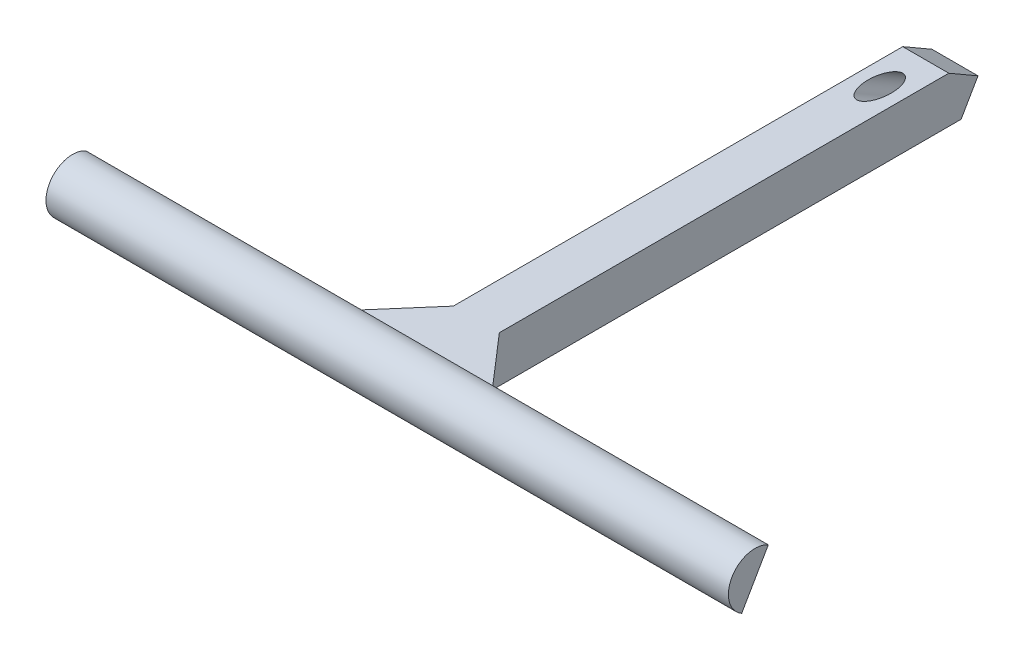
ISO-10303-21;
HEADER;
FILE_DESCRIPTION(('STEP AP214'),'2;1');
FILE_NAME('part.step','',(''),(''),'','','');
FILE_SCHEMA(('AUTOMOTIVE_DESIGN { 1 0 10303 214 1 1 1 1 }'));
ENDSEC;
DATA;
#1=APPLICATION_CONTEXT('core data for automotive mechanical design processes');
#2=APPLICATION_PROTOCOL_DEFINITION('international standard','automotive_design',2000,#1);
#3=PRODUCT_CONTEXT('',#1,'mechanical');
#4=PRODUCT('Part','Part','',(#3));
#5=PRODUCT_RELATED_PRODUCT_CATEGORY('part','',(#4));
#6=PRODUCT_DEFINITION_FORMATION('','',#4);
#7=PRODUCT_DEFINITION_CONTEXT('part definition',#1,'design');
#8=PRODUCT_DEFINITION('design','',#6,#7);
#9=PRODUCT_DEFINITION_SHAPE('','',#8);
#10=(LENGTH_UNIT() NAMED_UNIT(*) SI_UNIT(.MILLI.,.METRE.));
#11=(NAMED_UNIT(*) PLANE_ANGLE_UNIT() SI_UNIT($,.RADIAN.));
#12=(NAMED_UNIT(*) SI_UNIT($,.STERADIAN.) SOLID_ANGLE_UNIT());
#13=UNCERTAINTY_MEASURE_WITH_UNIT(LENGTH_MEASURE(1.E-05),#10,'distance_accuracy_value','');
#14=(GEOMETRIC_REPRESENTATION_CONTEXT(3) GLOBAL_UNCERTAINTY_ASSIGNED_CONTEXT((#13)) GLOBAL_UNIT_ASSIGNED_CONTEXT((#10,
#11,#12)) REPRESENTATION_CONTEXT('',''));
#15=CARTESIAN_POINT('',(0.,0.,0.));
#16=DIRECTION('',(0.,0.,1.));
#17=DIRECTION('',(1.,0.,0.));
#18=AXIS2_PLACEMENT_3D('',#15,#16,#17);
#19=CARTESIAN_POINT('',(0.,2.7,0.));
#20=DIRECTION('',(0.,1.,0.));
#21=DIRECTION('',(0.,0.,1.));
#22=AXIS2_PLACEMENT_3D('',#19,#20,#21);
#23=PLANE('',#22);
#24=CARTESIAN_POINT('',(0.,2.7,-23.6765371804359));
#25=DIRECTION('',(0.,1.,0.));
#26=DIRECTION('',(0.,0.,-1.));
#27=AXIS2_PLACEMENT_3D('',#24,#25,#26);
#28=ELLIPSE('',#27,2.70000000000004,1.35);
#29=CARTESIAN_POINT('',(0.,2.7,-26.3765371804359));
#30=VERTEX_POINT('',#29);
#31=EDGE_CURVE('E161',#30,#30,#28,.T.);
#32=ORIENTED_EDGE('',*,*,#31,.F.);
#33=EDGE_LOOP('',(#32));
#34=FACE_BOUND('',#33,.T.);
#35=DIRECTION('',(0.,0.,-1.));
#36=VECTOR('',#35,1.);
#37=CARTESIAN_POINT('',(-2.7,2.7,0.));
#38=LINE('',#37,#36);
#39=CARTESIAN_POINT('',(-2.7,2.7,23.6088058544797));
#40=VERTEX_POINT('',#39);
#41=CARTESIAN_POINT('',(-2.7,2.7,-29.076537180436));
#42=VERTEX_POINT('',#41);
#43=EDGE_CURVE('E184',#40,#42,#38,.T.);
#44=ORIENTED_EDGE('',*,*,#43,.F.);
#45=DIRECTION('',(-0.654653670707974,0.,0.755928946018457));
#46=VECTOR('',#45,1.);
#47=CARTESIAN_POINT('',(0.220832231856313,2.7,20.2361193038398));
#48=LINE('',#47,#46);
#49=CARTESIAN_POINT('',(-7.69999999999999,2.7,29.382308546376));
#50=VERTEX_POINT('',#49);
#51=EDGE_CURVE('E203',#40,#50,#48,.T.);
#52=ORIENTED_EDGE('',*,*,#51,.T.);
#53=DIRECTION('',(-1.,0.,0.));
#54=VECTOR('',#53,1.);
#55=CARTESIAN_POINT('',(40.,2.7,29.382308546376));
#56=LINE('',#55,#54);
#57=CARTESIAN_POINT('',(7.70000000000005,2.7,29.382308546376));
#58=VERTEX_POINT('',#57);
#59=EDGE_CURVE('E224',#58,#50,#56,.T.);
#60=ORIENTED_EDGE('',*,*,#59,.F.);
#61=DIRECTION('',(0.654653670707981,0.,0.755928946018451));
#62=VECTOR('',#61,1.);
#63=CARTESIAN_POINT('',(4.64345348242944,2.7,25.852912636956));
#64=LINE('',#63,#62);
#65=CARTESIAN_POINT('',(2.7,2.7,23.6088058544798));
#66=VERTEX_POINT('',#65);
#67=EDGE_CURVE('E208',#58,#66,#64,.F.);
#68=ORIENTED_EDGE('',*,*,#67,.T.);
#69=DIRECTION('',(0.,0.,-1.));
#70=VECTOR('',#69,1.);
#71=CARTESIAN_POINT('',(2.7,2.7,0.));
#72=LINE('',#71,#70);
#73=CARTESIAN_POINT('',(2.7,2.7,-29.076537180436));
#74=VERTEX_POINT('',#73);
#75=EDGE_CURVE('E186',#66,#74,#72,.T.);
#76=ORIENTED_EDGE('',*,*,#75,.T.);
#77=DIRECTION('',(1.,0.,0.));
#78=VECTOR('',#77,1.);
#79=CARTESIAN_POINT('',(-2.7,2.7,-29.076537180436));
#80=LINE('',#79,#78);
#81=EDGE_CURVE('E178',#42,#74,#80,.T.);
#82=ORIENTED_EDGE('',*,*,#81,.F.);
#83=EDGE_LOOP('',(#44,#52,#60,#68,#76,#82));
#84=FACE_BOUND('',#83,.T.);
#85=ADVANCED_FACE('F75',(#34,#84),#23,.T.);
#86=CARTESIAN_POINT('',(-2.7,2.7,0.));
#87=DIRECTION('',(-1.,0.,0.));
#88=DIRECTION('',(0.,0.,1.));
#89=AXIS2_PLACEMENT_3D('',#86,#87,#88);
#90=PLANE('',#89);
#91=DIRECTION('',(0.,0.,-1.));
#92=VECTOR('',#91,1.);
#93=CARTESIAN_POINT('',(-2.7,-2.7,0.));
#94=LINE('',#93,#92);
#95=CARTESIAN_POINT('',(-2.7,-2.7,26.7264973081037));
#96=VERTEX_POINT('',#95);
#97=CARTESIAN_POINT('',(-2.7,-2.7,-30.5234628195641));
#98=VERTEX_POINT('',#97);
#99=EDGE_CURVE('E181',#96,#98,#94,.T.);
#100=ORIENTED_EDGE('',*,*,#99,.F.);
#101=DIRECTION('',(0.,0.866025403784439,-0.5));
#102=VECTOR('',#101,1.);
#103=CARTESIAN_POINT('',(-2.7,12.9229128114971,17.7066043908598));
#104=LINE('',#103,#102);
#105=EDGE_CURVE('E189',#96,#40,#104,.T.);
#106=ORIENTED_EDGE('',*,*,#105,.T.);
#107=ORIENTED_EDGE('',*,*,#43,.T.);
#108=DIRECTION('',(0.,0.499999999999995,0.866025403784441));
#109=VECTOR('',#108,1.);
#110=CARTESIAN_POINT('',(-2.7,14.6155099261701,-8.43826859021784));
#111=LINE('',#110,#109);
#112=CARTESIAN_POINT('',(-2.7,0.723462819564048,-32.5));
#113=VERTEX_POINT('',#112);
#114=EDGE_CURVE('E175',#113,#42,#111,.T.);
#115=ORIENTED_EDGE('',*,*,#114,.F.);
#116=DIRECTION('',(0.,0.866025403784442,-0.499999999999993));
#117=VECTOR('',#116,1.);
#118=CARTESIAN_POINT('',(-2.7,-13.892047106606,-24.0617314097822));
#119=LINE('',#118,#117);
#120=EDGE_CURVE('E167',#98,#113,#119,.T.);
#121=ORIENTED_EDGE('',*,*,#120,.F.);
#122=EDGE_LOOP('',(#100,#106,#107,#115,#121));
#123=FACE_BOUND('',#122,.T.);
#124=ADVANCED_FACE('F248',(#123),#90,.T.);
#125=CARTESIAN_POINT('',(2.7,2.7,0.));
#126=DIRECTION('',(-1.,0.,0.));
#127=DIRECTION('',(0.,0.,1.));
#128=AXIS2_PLACEMENT_3D('',#125,#126,#127);
#129=PLANE('',#128);
#130=ORIENTED_EDGE('',*,*,#75,.F.);
#131=DIRECTION('',(0.,-0.866025403784439,0.5));
#132=VECTOR('',#131,1.);
#133=CARTESIAN_POINT('',(2.7,-5.2,28.1698729810778));
#134=LINE('',#133,#132);
#135=CARTESIAN_POINT('',(2.7,-2.7,26.7264973081037));
#136=VERTEX_POINT('',#135);
#137=EDGE_CURVE('E201',#66,#136,#134,.T.);
#138=ORIENTED_EDGE('',*,*,#137,.T.);
#139=DIRECTION('',(0.,0.,-1.));
#140=VECTOR('',#139,1.);
#141=CARTESIAN_POINT('',(2.7,-2.7,0.));
#142=LINE('',#141,#140);
#143=CARTESIAN_POINT('',(2.7,-2.7,-30.5234628195641));
#144=VERTEX_POINT('',#143);
#145=EDGE_CURVE('E187',#136,#144,#142,.T.);
#146=ORIENTED_EDGE('',*,*,#145,.T.);
#147=DIRECTION('',(0.,0.866025403784442,-0.499999999999993));
#148=VECTOR('',#147,1.);
#149=CARTESIAN_POINT('',(2.7,-13.892047106606,-24.0617314097822));
#150=LINE('',#149,#148);
#151=CARTESIAN_POINT('',(2.7,0.723462819564048,-32.5));
#152=VERTEX_POINT('',#151);
#153=EDGE_CURVE('E166',#144,#152,#150,.T.);
#154=ORIENTED_EDGE('',*,*,#153,.T.);
#155=DIRECTION('',(0.,0.499999999999995,0.866025403784441));
#156=VECTOR('',#155,1.);
#157=CARTESIAN_POINT('',(2.7,14.6155099261701,-8.43826859021784));
#158=LINE('',#157,#156);
#159=EDGE_CURVE('E169',#152,#74,#158,.T.);
#160=ORIENTED_EDGE('',*,*,#159,.T.);
#161=EDGE_LOOP('',(#130,#138,#146,#154,#160));
#162=FACE_BOUND('',#161,.T.);
#163=ADVANCED_FACE('F264',(#162),#129,.F.);
#164=CARTESIAN_POINT('',(0.,-2.7,0.));
#165=DIRECTION('',(0.,1.,0.));
#166=DIRECTION('',(0.,0.,1.));
#167=AXIS2_PLACEMENT_3D('',#164,#165,#166);
#168=PLANE('',#167);
#169=DIRECTION('',(1.,0.,0.));
#170=VECTOR('',#169,1.);
#171=CARTESIAN_POINT('',(-2.7,-2.7,-30.5234628195641));
#172=LINE('',#171,#170);
#173=CARTESIAN_POINT('',(-0.502299359073222,-2.7,-30.5234628195641));
#174=VERTEX_POINT('',#173);
#175=EDGE_CURVE('E160',#98,#174,#172,.T.);
#176=ORIENTED_EDGE('',*,*,#175,.T.);
#177=CARTESIAN_POINT('',(0.,-2.7,-33.029611541308));
#178=DIRECTION('',(0.,1.,0.));
#179=DIRECTION('',(0.,0.,-1.));
#180=AXIS2_PLACEMENT_3D('',#177,#178,#179);
#181=ELLIPSE('',#180,2.70000000000004,1.35);
#182=CARTESIAN_POINT('',(0.502299359073221,-2.7,-30.5234628195641));
#183=VERTEX_POINT('',#182);
#184=EDGE_CURVE('E89',#174,#183,#181,.T.);
#185=ORIENTED_EDGE('',*,*,#184,.T.);
#186=EDGE_CURVE('E158',#183,#144,#172,.T.);
#187=ORIENTED_EDGE('',*,*,#186,.T.);
#188=ORIENTED_EDGE('',*,*,#145,.F.);
#189=DIRECTION('',(-0.654653670707981,0.,-0.755928946018451));
#190=VECTOR('',#189,1.);
#191=CARTESIAN_POINT('',(-11.6833289274253,-2.7,10.11805965192));
#192=LINE('',#191,#190);
#193=CARTESIAN_POINT('',(7.70000000000005,-2.7,32.5));
#194=VERTEX_POINT('',#193);
#195=EDGE_CURVE('E84',#136,#194,#192,.F.);
#196=ORIENTED_EDGE('',*,*,#195,.T.);
#197=DIRECTION('',(-1.,0.,0.));
#198=VECTOR('',#197,1.);
#199=CARTESIAN_POINT('',(0.,-2.7,32.5));
#200=LINE('',#199,#198);
#201=CARTESIAN_POINT('',(-7.69999999999999,-2.7,32.5));
#202=VERTEX_POINT('',#201);
#203=EDGE_CURVE('E97',#194,#202,#200,.T.);
#204=ORIENTED_EDGE('',*,*,#203,.T.);
#205=DIRECTION('',(0.654653670707974,0.,-0.755928946018457));
#206=VECTOR('',#205,1.);
#207=CARTESIAN_POINT('',(11.6833289274252,-2.7,10.1180596519198));
#208=LINE('',#207,#206);
#209=EDGE_CURVE('E206',#202,#96,#208,.T.);
#210=ORIENTED_EDGE('',*,*,#209,.T.);
#211=ORIENTED_EDGE('',*,*,#99,.T.);
#212=EDGE_LOOP('',(#176,#185,#187,#188,#196,#204,#210,#211));
#213=FACE_BOUND('',#212,.T.);
#214=ADVANCED_FACE('F156',(#213),#168,.F.);
#215=CARTESIAN_POINT('',(-2.7,14.6155099261701,-8.43826859021784));
#216=DIRECTION('',(0.,0.866025403784441,-0.499999999999995));
#217=DIRECTION('',(0.,0.499999999999995,0.866025403784441));
#218=AXIS2_PLACEMENT_3D('',#215,#216,#217);
#219=PLANE('',#218);
#220=DIRECTION('',(1.,0.,0.));
#221=VECTOR('',#220,1.);
#222=CARTESIAN_POINT('',(-2.7,0.723462819564048,-32.5));
#223=LINE('',#222,#221);
#224=EDGE_CURVE('E179',#113,#152,#223,.T.);
#225=ORIENTED_EDGE('',*,*,#224,.F.);
#226=ORIENTED_EDGE('',*,*,#114,.T.);
#227=ORIENTED_EDGE('',*,*,#81,.T.);
#228=ORIENTED_EDGE('',*,*,#159,.F.);
#229=EDGE_LOOP('',(#225,#226,#227,#228));
#230=FACE_BOUND('',#229,.T.);
#231=ADVANCED_FACE('F260',(#230),#219,.T.);
#232=CARTESIAN_POINT('',(-2.7,-13.892047106606,-24.0617314097822));
#233=DIRECTION('',(0.,-0.499999999999993,-0.866025403784442));
#234=DIRECTION('',(0.,0.866025403784442,-0.499999999999993));
#235=AXIS2_PLACEMENT_3D('',#232,#233,#234);
#236=PLANE('',#235);
#237=CARTESIAN_POINT('',(0.,-1.61480577065394,-31.15));
#238=DIRECTION('',(0.,-0.499999999999993,-0.866025403784442));
#239=DIRECTION('',(0.,0.866025403784442,-0.499999999999993));
#240=AXIS2_PLACEMENT_3D('',#237,#238,#239);
#241=CIRCLE('',#240,1.35);
#242=EDGE_CURVE('E12',#174,#183,#241,.T.);
#243=ORIENTED_EDGE('',*,*,#242,.F.);
#244=ORIENTED_EDGE('',*,*,#175,.F.);
#245=ORIENTED_EDGE('',*,*,#120,.T.);
#246=ORIENTED_EDGE('',*,*,#224,.T.);
#247=ORIENTED_EDGE('',*,*,#153,.F.);
#248=ORIENTED_EDGE('',*,*,#186,.F.);
#249=EDGE_LOOP('',(#243,#244,#245,#246,#247,#248));
#250=FACE_BOUND('',#249,.T.);
#251=ADVANCED_FACE('F164',(#250),#236,.T.);
#252=CARTESIAN_POINT('',(40.,13.3979128114971,23.205865704891));
#253=DIRECTION('',(0.,0.5,0.866025403784439));
#254=DIRECTION('',(0.,-0.866025403784439,0.5));
#255=AXIS2_PLACEMENT_3D('',#252,#253,#254);
#256=PLANE('',#255);
#257=DIRECTION('',(-1.,0.,0.));
#258=VECTOR('',#257,1.);
#259=CARTESIAN_POINT('',(40.,-2.7,32.5));
#260=LINE('',#259,#258);
#261=CARTESIAN_POINT('',(40.,-2.7,32.5));
#262=VERTEX_POINT('',#261);
#263=EDGE_CURVE('E221',#262,#194,#260,.T.);
#264=ORIENTED_EDGE('',*,*,#263,.T.);
#265=DIRECTION('',(0.,0.866025403784439,-0.5));
#266=VECTOR('',#265,1.);
#267=CARTESIAN_POINT('',(7.70000000000005,2.7,29.382308546376));
#268=LINE('',#267,#266);
#269=EDGE_CURVE('E198',#194,#58,#268,.T.);
#270=ORIENTED_EDGE('',*,*,#269,.T.);
#271=CARTESIAN_POINT('',(40.,2.7,29.382308546376));
#272=VERTEX_POINT('',#271);
#273=EDGE_CURVE('E220',#272,#58,#56,.T.);
#274=ORIENTED_EDGE('',*,*,#273,.F.);
#275=DIRECTION('',(0.,0.866025403784439,-0.5));
#276=VECTOR('',#275,1.);
#277=CARTESIAN_POINT('',(40.,13.3979128114971,23.205865704891));
#278=LINE('',#277,#276);
#279=EDGE_CURVE('E236',#262,#272,#278,.T.);
#280=ORIENTED_EDGE('',*,*,#279,.F.);
#281=EDGE_LOOP('',(#264,#270,#274,#280));
#282=FACE_BOUND('',#281,.T.);
#283=ADVANCED_FACE('F218',(#282),#256,.F.);
#284=CARTESIAN_POINT('',(-40.,2.7,29.382308546376));
#285=VERTEX_POINT('',#284);
#286=EDGE_CURVE('E229',#50,#285,#56,.T.);
#287=ORIENTED_EDGE('',*,*,#286,.F.);
#288=DIRECTION('',(0.,-0.866025403784439,0.5));
#289=VECTOR('',#288,1.);
#290=CARTESIAN_POINT('',(-7.69999999999999,13.3979128114971,23.205865704891));
#291=LINE('',#290,#289);
#292=EDGE_CURVE('E195',#50,#202,#291,.T.);
#293=ORIENTED_EDGE('',*,*,#292,.T.);
#294=CARTESIAN_POINT('',(-40.,-2.7,32.5));
#295=VERTEX_POINT('',#294);
#296=EDGE_CURVE('E232',#202,#295,#260,.T.);
#297=ORIENTED_EDGE('',*,*,#296,.T.);
#298=DIRECTION('',(0.,0.866025403784439,-0.5));
#299=VECTOR('',#298,1.);
#300=CARTESIAN_POINT('',(-40.,13.3979128114971,23.205865704891));
#301=LINE('',#300,#299);
#302=EDGE_CURVE('E237',#295,#285,#301,.T.);
#303=ORIENTED_EDGE('',*,*,#302,.T.);
#304=EDGE_LOOP('',(#287,#293,#297,#303));
#305=FACE_BOUND('',#304,.T.);
#306=ADVANCED_FACE('F289',(#305),#256,.F.);
#307=CARTESIAN_POINT('',(40.,0.,30.941154273188));
#308=DIRECTION('',(-1.,0.,0.));
#309=DIRECTION('',(0.,0.,1.));
#310=AXIS2_PLACEMENT_3D('',#307,#308,#309);
#311=CYLINDRICAL_SURFACE('',#310,3.11769145362398);
#312=CARTESIAN_POINT('',(-40.,0.,30.941154273188));
#313=DIRECTION('',(1.,0.,0.));
#314=DIRECTION('',(0.,0.,-1.));
#315=AXIS2_PLACEMENT_3D('',#312,#313,#314);
#316=CIRCLE('',#315,3.11769145362398);
#317=EDGE_CURVE('E234',#285,#295,#316,.T.);
#318=ORIENTED_EDGE('',*,*,#317,.T.);
#319=ORIENTED_EDGE('',*,*,#296,.F.);
#320=ORIENTED_EDGE('',*,*,#203,.F.);
#321=ORIENTED_EDGE('',*,*,#263,.F.);
#322=CARTESIAN_POINT('',(40.,0.,30.941154273188));
#323=DIRECTION('',(1.,0.,0.));
#324=DIRECTION('',(0.,0.,-1.));
#325=AXIS2_PLACEMENT_3D('',#322,#323,#324);
#326=CIRCLE('',#325,3.11769145362398);
#327=EDGE_CURVE('E226',#272,#262,#326,.T.);
#328=ORIENTED_EDGE('',*,*,#327,.F.);
#329=ORIENTED_EDGE('',*,*,#273,.T.);
#330=ORIENTED_EDGE('',*,*,#59,.T.);
#331=ORIENTED_EDGE('',*,*,#286,.T.);
#332=EDGE_LOOP('',(#318,#319,#320,#321,#328,#329,#330,#331));
#333=FACE_BOUND('',#332,.T.);
#334=ADVANCED_FACE('F223',(#333),#311,.T.);
#335=CARTESIAN_POINT('',(40.,0.,0.));
#336=DIRECTION('',(1.,0.,0.));
#337=DIRECTION('',(0.,0.,-1.));
#338=AXIS2_PLACEMENT_3D('',#335,#336,#337);
#339=PLANE('',#338);
#340=ORIENTED_EDGE('',*,*,#279,.T.);
#341=ORIENTED_EDGE('',*,*,#327,.T.);
#342=EDGE_LOOP('',(#340,#341));
#343=FACE_BOUND('',#342,.T.);
#344=ADVANCED_FACE('F284',(#343),#339,.T.);
#345=CARTESIAN_POINT('',(-40.,0.,0.));
#346=DIRECTION('',(1.,0.,0.));
#347=DIRECTION('',(0.,0.,-1.));
#348=AXIS2_PLACEMENT_3D('',#345,#346,#347);
#349=PLANE('',#348);
#350=ORIENTED_EDGE('',*,*,#302,.F.);
#351=ORIENTED_EDGE('',*,*,#317,.F.);
#352=EDGE_LOOP('',(#350,#351));
#353=FACE_BOUND('',#352,.T.);
#354=ADVANCED_FACE('F278',(#353),#349,.F.);
#355=CARTESIAN_POINT('',(-2.7,12.9229128114971,17.7066043908598));
#356=DIRECTION('',(0.70710678118655,0.353553390593272,0.612372435695792));
#357=DIRECTION('',(0.,0.866025403784439,-0.5));
#358=AXIS2_PLACEMENT_3D('',#355,#356,#357);
#359=PLANE('',#358);
#360=ORIENTED_EDGE('',*,*,#209,.F.);
#361=ORIENTED_EDGE('',*,*,#292,.F.);
#362=ORIENTED_EDGE('',*,*,#51,.F.);
#363=ORIENTED_EDGE('',*,*,#105,.F.);
#364=EDGE_LOOP('',(#360,#361,#362,#363));
#365=FACE_BOUND('',#364,.T.);
#366=ADVANCED_FACE('F274',(#365),#359,.F.);
#367=CARTESIAN_POINT('',(7.70000000000005,13.3979128114971,23.205865704891));
#368=DIRECTION('',(0.707106781186544,-0.353553390593276,-0.612372435695798));
#369=DIRECTION('',(0.,-0.866025403784439,0.5));
#370=AXIS2_PLACEMENT_3D('',#367,#368,#369);
#371=PLANE('',#370);
#372=ORIENTED_EDGE('',*,*,#195,.F.);
#373=ORIENTED_EDGE('',*,*,#137,.F.);
#374=ORIENTED_EDGE('',*,*,#67,.F.);
#375=ORIENTED_EDGE('',*,*,#269,.F.);
#376=EDGE_LOOP('',(#372,#373,#374,#375));
#377=FACE_BOUND('',#376,.T.);
#378=ADVANCED_FACE('F78',(#377),#371,.T.);
#379=CARTESIAN_POINT('',(0.,27.804577010855,19.8058657048914));
#380=DIRECTION('',(0.,-0.499999999999993,-0.866025403784442));
#381=DIRECTION('',(0.,0.866025403784443,-0.499999999999993));
#382=AXIS2_PLACEMENT_3D('',#379,#380,#381);
#383=CYLINDRICAL_SURFACE('',#382,1.35);
#384=ORIENTED_EDGE('',*,*,#31,.T.);
#385=EDGE_LOOP('',(#384));
#386=FACE_BOUND('',#385,.T.);
#387=ORIENTED_EDGE('',*,*,#242,.T.);
#388=ORIENTED_EDGE('',*,*,#184,.F.);
#389=EDGE_LOOP('',(#387,#388));
#390=FACE_BOUND('',#389,.T.);
#391=ADVANCED_FACE('F150',(#386,#390),#383,.F.);
#392=CLOSED_SHELL('',(#85,#124,#163,#214,#231,#251,#283,#306,#334,#344,#354,#366,#378,#391));
#393=MANIFOLD_SOLID_BREP('B2',#392);
#394=ADVANCED_BREP_SHAPE_REPRESENTATION('',(#18,#393),#14);
#395=SHAPE_DEFINITION_REPRESENTATION(#9,#394);
ENDSEC;
END-ISO-10303-21;
